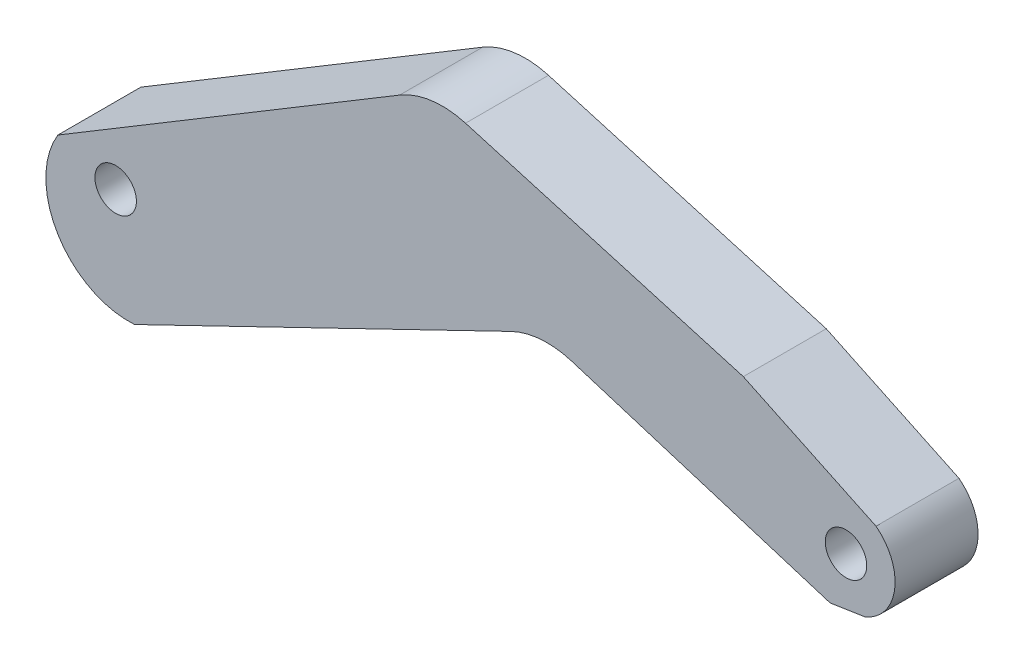
ISO-10303-21;
HEADER;
FILE_DESCRIPTION(('STEP AP214'),'2;1');
FILE_NAME('part.step','',(''),(''),'','','');
FILE_SCHEMA(('AUTOMOTIVE_DESIGN { 1 0 10303 214 1 1 1 1 }'));
ENDSEC;
DATA;
#1=APPLICATION_CONTEXT('core data for automotive mechanical design processes');
#2=APPLICATION_PROTOCOL_DEFINITION('international standard','automotive_design',2000,#1);
#3=PRODUCT_CONTEXT('',#1,'mechanical');
#4=PRODUCT('Part','Part','',(#3));
#5=PRODUCT_RELATED_PRODUCT_CATEGORY('part','',(#4));
#6=PRODUCT_DEFINITION_FORMATION('','',#4);
#7=PRODUCT_DEFINITION_CONTEXT('part definition',#1,'design');
#8=PRODUCT_DEFINITION('design','',#6,#7);
#9=PRODUCT_DEFINITION_SHAPE('','',#8);
#10=(LENGTH_UNIT() NAMED_UNIT(*) SI_UNIT(.MILLI.,.METRE.));
#11=(NAMED_UNIT(*) PLANE_ANGLE_UNIT() SI_UNIT($,.RADIAN.));
#12=(NAMED_UNIT(*) SI_UNIT($,.STERADIAN.) SOLID_ANGLE_UNIT());
#13=UNCERTAINTY_MEASURE_WITH_UNIT(LENGTH_MEASURE(1.E-05),#10,'distance_accuracy_value','');
#14=(GEOMETRIC_REPRESENTATION_CONTEXT(3) GLOBAL_UNCERTAINTY_ASSIGNED_CONTEXT((#13)) GLOBAL_UNIT_ASSIGNED_CONTEXT((#10,
#11,#12)) REPRESENTATION_CONTEXT('',''));
#15=CARTESIAN_POINT('',(0.,0.,0.));
#16=DIRECTION('',(0.,0.,1.));
#17=DIRECTION('',(1.,0.,0.));
#18=AXIS2_PLACEMENT_3D('',#15,#16,#17);
#19=CARTESIAN_POINT('',(3.97150570910921,-2.26070248762667,4.));
#20=DIRECTION('',(0.,0.,-1.));
#21=DIRECTION('',(-1.,0.,0.));
#22=AXIS2_PLACEMENT_3D('',#19,#20,#21);
#23=CYLINDRICAL_SURFACE('',#22,4.);
#24=CARTESIAN_POINT('',(3.97150570910921,-2.26070248762667,0.));
#25=DIRECTION('',(0.,0.,1.));
#26=DIRECTION('',(1.,0.,0.));
#27=AXIS2_PLACEMENT_3D('',#24,#25,#26);
#28=CIRCLE('',#27,4.);
#29=CARTESIAN_POINT('',(5.1565767586887,1.55971720233523,0.));
#30=VERTEX_POINT('',#29);
#31=CARTESIAN_POINT('',(2.22855913745378,1.33959434018553,0.));
#32=VERTEX_POINT('',#31);
#33=EDGE_CURVE('E149',#30,#32,#28,.T.);
#34=ORIENTED_EDGE('',*,*,#33,.F.);
#35=DIRECTION('',(0.,0.,-1.));
#36=VECTOR('',#35,1.);
#37=CARTESIAN_POINT('',(5.1565767586887,1.55971720233523,4.));
#38=LINE('',#37,#36);
#39=CARTESIAN_POINT('',(5.1565767586887,1.55971720233523,4.));
#40=VERTEX_POINT('',#39);
#41=EDGE_CURVE('E11',#40,#30,#38,.T.);
#42=ORIENTED_EDGE('',*,*,#41,.F.);
#43=CARTESIAN_POINT('',(3.97150570910921,-2.26070248762667,4.));
#44=DIRECTION('',(0.,0.,1.));
#45=DIRECTION('',(1.,0.,0.));
#46=AXIS2_PLACEMENT_3D('',#43,#44,#45);
#47=CIRCLE('',#46,4.);
#48=CARTESIAN_POINT('',(2.22855913745378,1.33959434018553,4.));
#49=VERTEX_POINT('',#48);
#50=EDGE_CURVE('E178',#40,#49,#47,.T.);
#51=ORIENTED_EDGE('',*,*,#50,.T.);
#52=DIRECTION('',(0.,0.,-1.));
#53=VECTOR('',#52,1.);
#54=CARTESIAN_POINT('',(2.22855913745378,1.33959434018553,4.));
#55=LINE('',#54,#53);
#56=EDGE_CURVE('E52',#49,#32,#55,.T.);
#57=ORIENTED_EDGE('',*,*,#56,.T.);
#58=EDGE_LOOP('',(#34,#42,#51,#57));
#59=FACE_BOUND('',#58,.T.);
#60=ADVANCED_FACE('F36',(#59),#23,.F.);
#61=CARTESIAN_POINT('',(0.893964578407848,2.88195368428732,4.));
#62=DIRECTION('',(-0.296267762394871,-0.955104922490475,0.));
#63=DIRECTION('',(0.955104922490475,-0.296267762394871,0.));
#64=AXIS2_PLACEMENT_3D('',#61,#62,#63);
#65=PLANE('',#64);
#66=DIRECTION('',(-0.955104922490475,0.296267762394871,0.));
#67=VECTOR('',#66,1.);
#68=CARTESIAN_POINT('',(0.893964578407848,2.88195368428732,0.));
#69=LINE('',#68,#67);
#70=CARTESIAN_POINT('',(17.6113707223977,-2.30368445315567,0.));
#71=VERTEX_POINT('',#70);
#72=EDGE_CURVE('E151',#71,#30,#69,.T.);
#73=ORIENTED_EDGE('',*,*,#72,.F.);
#74=DIRECTION('',(0.,0.,-1.));
#75=VECTOR('',#74,1.);
#76=CARTESIAN_POINT('',(17.6113707223977,-2.30368445315567,4.));
#77=LINE('',#76,#75);
#78=CARTESIAN_POINT('',(17.6113707223977,-2.30368445315567,4.));
#79=VERTEX_POINT('',#78);
#80=EDGE_CURVE('E44',#79,#71,#77,.T.);
#81=ORIENTED_EDGE('',*,*,#80,.F.);
#82=DIRECTION('',(-0.955104922490475,0.296267762394871,0.));
#83=VECTOR('',#82,1.);
#84=CARTESIAN_POINT('',(0.893964578407848,2.88195368428732,4.));
#85=LINE('',#84,#83);
#86=EDGE_CURVE('E207',#79,#40,#85,.T.);
#87=ORIENTED_EDGE('',*,*,#86,.T.);
#88=ORIENTED_EDGE('',*,*,#41,.T.);
#89=EDGE_LOOP('',(#73,#81,#87,#88));
#90=FACE_BOUND('',#89,.T.);
#91=ADVANCED_FACE('F206',(#90),#65,.T.);
#92=CARTESIAN_POINT('',(0.753219885039131,-4.89679015019644,4.));
#93=DIRECTION('',(-0.152031069248658,0.988375714990565,0.));
#94=DIRECTION('',(-0.988375714990565,-0.152031069248658,0.));
#95=AXIS2_PLACEMENT_3D('',#92,#93,#94);
#96=PLANE('',#95);
#97=DIRECTION('',(0.988375714990565,0.152031069248658,0.));
#98=VECTOR('',#97,1.);
#99=CARTESIAN_POINT('',(0.753219885039131,-4.89679015019644,0.));
#100=LINE('',#99,#98);
#101=CARTESIAN_POINT('',(19.3232779124066,-2.04036041898107,0.));
#102=VERTEX_POINT('',#101);
#103=EDGE_CURVE('E154',#71,#102,#100,.T.);
#104=ORIENTED_EDGE('',*,*,#103,.T.);
#105=DIRECTION('',(0.,0.,-1.));
#106=VECTOR('',#105,1.);
#107=CARTESIAN_POINT('',(19.3232779124066,-2.04036041898107,4.));
#108=LINE('',#107,#106);
#109=CARTESIAN_POINT('',(19.3232779124066,-2.04036041898107,4.));
#110=VERTEX_POINT('',#109);
#111=EDGE_CURVE('E189',#110,#102,#108,.T.);
#112=ORIENTED_EDGE('',*,*,#111,.F.);
#113=DIRECTION('',(0.988375714990565,0.152031069248658,0.));
#114=VECTOR('',#113,1.);
#115=CARTESIAN_POINT('',(0.753219885039131,-4.89679015019644,4.));
#116=LINE('',#115,#114);
#117=EDGE_CURVE('E196',#79,#110,#116,.T.);
#118=ORIENTED_EDGE('',*,*,#117,.F.);
#119=ORIENTED_EDGE('',*,*,#80,.T.);
#120=EDGE_LOOP('',(#104,#112,#118,#119));
#121=FACE_BOUND('',#120,.T.);
#122=ADVANCED_FACE('F194',(#121),#96,.F.);
#123=CARTESIAN_POINT('',(18.380854610389,0.132484859072968,4.));
#124=DIRECTION('',(0.,0.,-1.));
#125=DIRECTION('',(-1.,0.,0.));
#126=AXIS2_PLACEMENT_3D('',#123,#124,#125);
#127=CYLINDRICAL_SURFACE('',#126,2.36842105263136);
#128=CARTESIAN_POINT('',(18.380854610389,0.132484859072968,0.));
#129=DIRECTION('',(0.,0.,1.));
#130=DIRECTION('',(1.,0.,0.));
#131=AXIS2_PLACEMENT_3D('',#128,#129,#130);
#132=CIRCLE('',#131,2.36842105263136);
#133=CARTESIAN_POINT('',(19.8268859568226,2.00822781259268,0.));
#134=VERTEX_POINT('',#133);
#135=EDGE_CURVE('E156',#102,#134,#132,.T.);
#136=ORIENTED_EDGE('',*,*,#135,.T.);
#137=DIRECTION('',(0.,0.,-1.));
#138=VECTOR('',#137,1.);
#139=CARTESIAN_POINT('',(19.8268859568226,2.00822781259268,4.));
#140=LINE('',#139,#138);
#141=CARTESIAN_POINT('',(19.8268859568226,2.00822781259268,4.));
#142=VERTEX_POINT('',#141);
#143=EDGE_CURVE('E186',#142,#134,#140,.T.);
#144=ORIENTED_EDGE('',*,*,#143,.F.);
#145=CARTESIAN_POINT('',(18.380854610389,0.132484859072968,4.));
#146=DIRECTION('',(0.,0.,1.));
#147=DIRECTION('',(1.,0.,0.));
#148=AXIS2_PLACEMENT_3D('',#145,#146,#147);
#149=CIRCLE('',#148,2.36842105263136);
#150=EDGE_CURVE('E343',#110,#142,#149,.T.);
#151=ORIENTED_EDGE('',*,*,#150,.F.);
#152=ORIENTED_EDGE('',*,*,#111,.T.);
#153=EDGE_LOOP('',(#136,#144,#151,#152));
#154=FACE_BOUND('',#153,.T.);
#155=ADVANCED_FACE('F229',(#154),#127,.T.);
#156=CARTESIAN_POINT('',(4.43950795696351,9.3300151670607,4.));
#157=DIRECTION('',(-0.42966876368544,-0.902986574381383,0.));
#158=DIRECTION('',(0.902986574381383,-0.42966876368544,0.));
#159=AXIS2_PLACEMENT_3D('',#156,#157,#158);
#160=PLANE('',#159);
#161=DIRECTION('',(-0.902986574381383,0.42966876368544,0.));
#162=VECTOR('',#161,1.);
#163=CARTESIAN_POINT('',(4.43950795696351,9.3300151670607,0.));
#164=LINE('',#163,#162);
#165=CARTESIAN_POINT('',(13.4284948884407,5.05277892544953,0.));
#166=VERTEX_POINT('',#165);
#167=EDGE_CURVE('E158',#134,#166,#164,.T.);
#168=ORIENTED_EDGE('',*,*,#167,.T.);
#169=DIRECTION('',(0.,0.,-1.));
#170=VECTOR('',#169,1.);
#171=CARTESIAN_POINT('',(13.4284948884407,5.05277892544953,4.));
#172=LINE('',#171,#170);
#173=CARTESIAN_POINT('',(13.4284948884407,5.05277892544953,4.));
#174=VERTEX_POINT('',#173);
#175=EDGE_CURVE('E184',#174,#166,#172,.T.);
#176=ORIENTED_EDGE('',*,*,#175,.F.);
#177=DIRECTION('',(-0.902986574381383,0.42966876368544,0.));
#178=VECTOR('',#177,1.);
#179=CARTESIAN_POINT('',(4.43950795696351,9.3300151670607,4.));
#180=LINE('',#179,#178);
#181=EDGE_CURVE('E341',#142,#174,#180,.T.);
#182=ORIENTED_EDGE('',*,*,#181,.F.);
#183=ORIENTED_EDGE('',*,*,#143,.T.);
#184=EDGE_LOOP('',(#168,#176,#182,#183));
#185=FACE_BOUND('',#184,.T.);
#186=ADVANCED_FACE('F234',(#185),#160,.F.);
#187=CARTESIAN_POINT('',(2.3950236145675,8.25422220896877,4.));
#188=DIRECTION('',(0.278663881362198,0.960388692782331,0.));
#189=DIRECTION('',(-0.960388692782331,0.278663881362198,0.));
#190=AXIS2_PLACEMENT_3D('',#187,#188,#189);
#191=PLANE('',#190);
#192=DIRECTION('',(0.960388692782331,-0.278663881362198,0.));
#193=VECTOR('',#192,1.);
#194=CARTESIAN_POINT('',(2.3950236145675,8.25422220896877,0.));
#195=LINE('',#194,#193);
#196=CARTESIAN_POINT('',(0.036885671158208,8.93845337186818,0.));
#197=VERTEX_POINT('',#196);
#198=EDGE_CURVE('E161',#197,#166,#195,.T.);
#199=ORIENTED_EDGE('',*,*,#198,.F.);
#200=DIRECTION('',(0.,0.,-1.));
#201=VECTOR('',#200,1.);
#202=CARTESIAN_POINT('',(0.036885671158208,8.93845337186818,4.));
#203=LINE('',#202,#201);
#204=CARTESIAN_POINT('',(0.036885671158208,8.93845337186818,4.));
#205=VERTEX_POINT('',#204);
#206=EDGE_CURVE('E182',#205,#197,#203,.T.);
#207=ORIENTED_EDGE('',*,*,#206,.F.);
#208=DIRECTION('',(0.960388692782331,-0.278663881362198,0.));
#209=VECTOR('',#208,1.);
#210=CARTESIAN_POINT('',(2.3950236145675,8.25422220896877,4.));
#211=LINE('',#210,#209);
#212=EDGE_CURVE('E338',#205,#174,#211,.T.);
#213=ORIENTED_EDGE('',*,*,#212,.T.);
#214=ORIENTED_EDGE('',*,*,#175,.T.);
#215=EDGE_LOOP('',(#199,#207,#213,#214));
#216=FACE_BOUND('',#215,.T.);
#217=ADVANCED_FACE('F238',(#216),#191,.T.);
#218=CARTESIAN_POINT('',(-1.0777698542906,5.09689860073886,4.));
#219=DIRECTION('',(0.,0.,-1.));
#220=DIRECTION('',(-1.,0.,0.));
#221=AXIS2_PLACEMENT_3D('',#218,#219,#220);
#222=CYLINDRICAL_SURFACE('',#221,4.);
#223=CARTESIAN_POINT('',(-1.0777698542906,5.09689860073886,0.));
#224=DIRECTION('',(0.,0.,1.));
#225=DIRECTION('',(1.,0.,0.));
#226=AXIS2_PLACEMENT_3D('',#223,#224,#225);
#227=CIRCLE('',#226,4.);
#228=CARTESIAN_POINT('',(-3.13891846257725,8.52496896386707,0.));
#229=VERTEX_POINT('',#228);
#230=EDGE_CURVE('E164',#197,#229,#227,.T.);
#231=ORIENTED_EDGE('',*,*,#230,.T.);
#232=DIRECTION('',(0.,0.,-1.));
#233=VECTOR('',#232,1.);
#234=CARTESIAN_POINT('',(-3.13891846257725,8.52496896386707,4.));
#235=LINE('',#234,#233);
#236=CARTESIAN_POINT('',(-3.13891846257725,8.52496896386707,4.));
#237=VERTEX_POINT('',#236);
#238=EDGE_CURVE('E135',#237,#229,#235,.T.);
#239=ORIENTED_EDGE('',*,*,#238,.F.);
#240=CARTESIAN_POINT('',(-1.0777698542906,5.09689860073886,4.));
#241=DIRECTION('',(0.,0.,1.));
#242=DIRECTION('',(1.,0.,0.));
#243=AXIS2_PLACEMENT_3D('',#240,#241,#242);
#244=CIRCLE('',#243,4.);
#245=EDGE_CURVE('E123',#205,#237,#244,.T.);
#246=ORIENTED_EDGE('',*,*,#245,.F.);
#247=ORIENTED_EDGE('',*,*,#206,.T.);
#248=EDGE_LOOP('',(#231,#239,#246,#247));
#249=FACE_BOUND('',#248,.T.);
#250=ADVANCED_FACE('F242',(#249),#222,.T.);
#251=CARTESIAN_POINT('',(-4.59816114922741,7.64759023060302,4.));
#252=DIRECTION('',(0.515287152071663,-0.857017590782053,0.));
#253=DIRECTION('',(0.857017590782053,0.515287152071663,0.));
#254=AXIS2_PLACEMENT_3D('',#251,#252,#253);
#255=PLANE('',#254);
#256=DIRECTION('',(-0.857017590782053,-0.515287152071663,0.));
#257=VECTOR('',#256,1.);
#258=CARTESIAN_POINT('',(-4.59816114922741,7.64759023060302,0.));
#259=LINE('',#258,#257);
#260=CARTESIAN_POINT('',(-19.6186582636657,-1.38357699869119,0.));
#261=VERTEX_POINT('',#260);
#262=EDGE_CURVE('E132',#229,#261,#259,.T.);
#263=ORIENTED_EDGE('',*,*,#262,.T.);
#264=DIRECTION('',(0.,0.,-1.));
#265=VECTOR('',#264,1.);
#266=CARTESIAN_POINT('',(-19.6186582636657,-1.38357699869119,4.));
#267=LINE('',#266,#265);
#268=CARTESIAN_POINT('',(-19.6186582636657,-1.38357699869119,4.));
#269=VERTEX_POINT('',#268);
#270=EDGE_CURVE('E129',#269,#261,#267,.T.);
#271=ORIENTED_EDGE('',*,*,#270,.F.);
#272=DIRECTION('',(-0.857017590782053,-0.515287152071663,0.));
#273=VECTOR('',#272,1.);
#274=CARTESIAN_POINT('',(-4.59816114922741,7.64759023060302,4.));
#275=LINE('',#274,#273);
#276=EDGE_CURVE('E114',#237,#269,#275,.T.);
#277=ORIENTED_EDGE('',*,*,#276,.F.);
#278=ORIENTED_EDGE('',*,*,#238,.T.);
#279=EDGE_LOOP('',(#263,#271,#277,#278));
#280=FACE_BOUND('',#279,.T.);
#281=ADVANCED_FACE('F130',(#280),#255,.F.);
#282=CARTESIAN_POINT('',(-16.1981098054635,-3.45718454234322,4.));
#283=DIRECTION('',(0.,0.,-1.));
#284=DIRECTION('',(-1.,0.,0.));
#285=AXIS2_PLACEMENT_3D('',#282,#283,#284);
#286=CYLINDRICAL_SURFACE('',#285,4.);
#287=CARTESIAN_POINT('',(-16.1981098054635,-3.45718454234322,0.));
#288=DIRECTION('',(0.,0.,1.));
#289=DIRECTION('',(1.,0.,0.));
#290=AXIS2_PLACEMENT_3D('',#287,#288,#289);
#291=CIRCLE('',#290,4.);
#292=CARTESIAN_POINT('',(-15.9228098024518,-7.44769953521591,0.));
#293=VERTEX_POINT('',#292);
#294=EDGE_CURVE('E167',#261,#293,#291,.T.);
#295=ORIENTED_EDGE('',*,*,#294,.T.);
#296=DIRECTION('',(0.,0.,-1.));
#297=VECTOR('',#296,1.);
#298=CARTESIAN_POINT('',(-15.9228098024518,-7.44769953521591,4.));
#299=LINE('',#298,#297);
#300=CARTESIAN_POINT('',(-15.9228098024518,-7.44769953521591,4.));
#301=VERTEX_POINT('',#300);
#302=EDGE_CURVE('E84',#301,#293,#299,.T.);
#303=ORIENTED_EDGE('',*,*,#302,.F.);
#304=CARTESIAN_POINT('',(-16.1981098054635,-3.45718454234322,4.));
#305=DIRECTION('',(0.,0.,1.));
#306=DIRECTION('',(1.,0.,0.));
#307=AXIS2_PLACEMENT_3D('',#304,#305,#306);
#308=CIRCLE('',#307,4.);
#309=EDGE_CURVE('E120',#269,#301,#308,.T.);
#310=ORIENTED_EDGE('',*,*,#309,.F.);
#311=ORIENTED_EDGE('',*,*,#270,.T.);
#312=EDGE_LOOP('',(#295,#303,#310,#311));
#313=FACE_BOUND('',#312,.T.);
#314=ADVANCED_FACE('F137',(#313),#286,.T.);
#315=CARTESIAN_POINT('',(-16.8329121892214,-2.26070248762667,4.));
#316=DIRECTION('',(0.,0.,-1.));
#317=DIRECTION('',(-1.,0.,0.));
#318=AXIS2_PLACEMENT_3D('',#315,#316,#317);
#319=CYLINDRICAL_SURFACE('',#318,1.);
#320=CARTESIAN_POINT('',(-16.8329121892214,-2.26070248762667,4.));
#321=DIRECTION('',(0.,0.,1.));
#322=DIRECTION('',(1.,0.,0.));
#323=AXIS2_PLACEMENT_3D('',#320,#321,#322);
#324=CIRCLE('',#323,1.);
#325=CARTESIAN_POINT('',(-15.8329121892214,-2.26070248762667,4.));
#326=VERTEX_POINT('',#325);
#327=EDGE_CURVE('E140',#326,#326,#324,.T.);
#328=ORIENTED_EDGE('',*,*,#327,.T.);
#329=EDGE_LOOP('',(#328));
#330=FACE_BOUND('',#329,.T.);
#331=CARTESIAN_POINT('',(-16.8329121892214,-2.26070248762667,0.));
#332=DIRECTION('',(0.,0.,1.));
#333=DIRECTION('',(1.,0.,0.));
#334=AXIS2_PLACEMENT_3D('',#331,#332,#333);
#335=CIRCLE('',#334,1.);
#336=CARTESIAN_POINT('',(-15.8329121892214,-2.26070248762667,0.));
#337=VERTEX_POINT('',#336);
#338=EDGE_CURVE('E172',#337,#337,#335,.T.);
#339=ORIENTED_EDGE('',*,*,#338,.F.);
#340=EDGE_LOOP('',(#339));
#341=FACE_BOUND('',#340,.T.);
#342=ADVANCED_FACE('F211',(#330,#341),#319,.F.);
#343=CARTESIAN_POINT('',(-0.102254072364437,0.211219906766792,4.));
#344=DIRECTION('',(0.435736642913859,-0.900074206953049,0.));
#345=DIRECTION('',(0.900074206953049,0.435736642913859,0.));
#346=AXIS2_PLACEMENT_3D('',#343,#344,#345);
#347=PLANE('',#346);
#348=DIRECTION('',(-0.900074206953049,-0.435736642913859,0.));
#349=VECTOR('',#348,1.);
#350=CARTESIAN_POINT('',(-0.102254072364437,0.211219906766792,0.));
#351=LINE('',#350,#349);
#352=EDGE_CURVE('E169',#32,#293,#351,.T.);
#353=ORIENTED_EDGE('',*,*,#352,.F.);
#354=ORIENTED_EDGE('',*,*,#56,.F.);
#355=DIRECTION('',(-0.900074206953049,-0.435736642913859,0.));
#356=VECTOR('',#355,1.);
#357=CARTESIAN_POINT('',(-0.102254072364437,0.211219906766792,4.));
#358=LINE('',#357,#356);
#359=EDGE_CURVE('E138',#49,#301,#358,.T.);
#360=ORIENTED_EDGE('',*,*,#359,.T.);
#361=ORIENTED_EDGE('',*,*,#302,.T.);
#362=EDGE_LOOP('',(#353,#354,#360,#361));
#363=FACE_BOUND('',#362,.T.);
#364=ADVANCED_FACE('F208',(#363),#347,.T.);
#365=CARTESIAN_POINT('',(18.380854610389,0.132484859072968,4.));
#366=DIRECTION('',(0.,0.,-1.));
#367=DIRECTION('',(-1.,0.,0.));
#368=AXIS2_PLACEMENT_3D('',#365,#366,#367);
#369=CYLINDRICAL_SURFACE('',#368,1.);
#370=CARTESIAN_POINT('',(18.380854610389,0.132484859072968,4.));
#371=DIRECTION('',(0.,0.,1.));
#372=DIRECTION('',(1.,0.,0.));
#373=AXIS2_PLACEMENT_3D('',#370,#371,#372);
#374=CIRCLE('',#373,1.);
#375=CARTESIAN_POINT('',(19.380854610389,0.132484859072968,4.));
#376=VERTEX_POINT('',#375);
#377=EDGE_CURVE('E146',#376,#376,#374,.T.);
#378=ORIENTED_EDGE('',*,*,#377,.T.);
#379=EDGE_LOOP('',(#378));
#380=FACE_BOUND('',#379,.T.);
#381=CARTESIAN_POINT('',(18.380854610389,0.132484859072968,0.));
#382=DIRECTION('',(0.,0.,1.));
#383=DIRECTION('',(1.,0.,0.));
#384=AXIS2_PLACEMENT_3D('',#381,#382,#383);
#385=CIRCLE('',#384,1.);
#386=CARTESIAN_POINT('',(19.380854610389,0.132484859072968,0.));
#387=VERTEX_POINT('',#386);
#388=EDGE_CURVE('E175',#387,#387,#385,.T.);
#389=ORIENTED_EDGE('',*,*,#388,.F.);
#390=EDGE_LOOP('',(#389));
#391=FACE_BOUND('',#390,.T.);
#392=ADVANCED_FACE('F210',(#380,#391),#369,.F.);
#393=CARTESIAN_POINT('',(0.,0.,4.));
#394=DIRECTION('',(0.,0.,1.));
#395=DIRECTION('',(1.,0.,0.));
#396=AXIS2_PLACEMENT_3D('',#393,#394,#395);
#397=PLANE('',#396);
#398=ORIENTED_EDGE('',*,*,#50,.F.);
#399=ORIENTED_EDGE('',*,*,#86,.F.);
#400=ORIENTED_EDGE('',*,*,#117,.T.);
#401=ORIENTED_EDGE('',*,*,#150,.T.);
#402=ORIENTED_EDGE('',*,*,#181,.T.);
#403=ORIENTED_EDGE('',*,*,#212,.F.);
#404=ORIENTED_EDGE('',*,*,#245,.T.);
#405=ORIENTED_EDGE('',*,*,#276,.T.);
#406=ORIENTED_EDGE('',*,*,#309,.T.);
#407=ORIENTED_EDGE('',*,*,#359,.F.);
#408=EDGE_LOOP('',(#398,#399,#400,#401,#402,#403,#404,#405,#406,#407));
#409=FACE_BOUND('',#408,.T.);
#410=ORIENTED_EDGE('',*,*,#327,.F.);
#411=EDGE_LOOP('',(#410));
#412=FACE_BOUND('',#411,.T.);
#413=ORIENTED_EDGE('',*,*,#377,.F.);
#414=EDGE_LOOP('',(#413));
#415=FACE_BOUND('',#414,.T.);
#416=ADVANCED_FACE('F116',(#409,#412,#415),#397,.T.);
#417=CARTESIAN_POINT('',(0.,0.,0.));
#418=DIRECTION('',(0.,0.,1.));
#419=DIRECTION('',(1.,0.,0.));
#420=AXIS2_PLACEMENT_3D('',#417,#418,#419);
#421=PLANE('',#420);
#422=ORIENTED_EDGE('',*,*,#33,.T.);
#423=ORIENTED_EDGE('',*,*,#352,.T.);
#424=ORIENTED_EDGE('',*,*,#294,.F.);
#425=ORIENTED_EDGE('',*,*,#262,.F.);
#426=ORIENTED_EDGE('',*,*,#230,.F.);
#427=ORIENTED_EDGE('',*,*,#198,.T.);
#428=ORIENTED_EDGE('',*,*,#167,.F.);
#429=ORIENTED_EDGE('',*,*,#135,.F.);
#430=ORIENTED_EDGE('',*,*,#103,.F.);
#431=ORIENTED_EDGE('',*,*,#72,.T.);
#432=EDGE_LOOP('',(#422,#423,#424,#425,#426,#427,#428,#429,#430,#431));
#433=FACE_BOUND('',#432,.T.);
#434=ORIENTED_EDGE('',*,*,#338,.T.);
#435=EDGE_LOOP('',(#434));
#436=FACE_BOUND('',#435,.T.);
#437=ORIENTED_EDGE('',*,*,#388,.T.);
#438=EDGE_LOOP('',(#437));
#439=FACE_BOUND('',#438,.T.);
#440=ADVANCED_FACE('F203',(#433,#436,#439),#421,.F.);
#441=CLOSED_SHELL('',(#60,#91,#122,#155,#186,#217,#250,#281,#314,#342,#364,#392,#416,#440));
#442=MANIFOLD_SOLID_BREP('B2',#441);
#443=ADVANCED_BREP_SHAPE_REPRESENTATION('',(#18,#442),#14);
#444=SHAPE_DEFINITION_REPRESENTATION(#9,#443);
ENDSEC;
END-ISO-10303-21;
